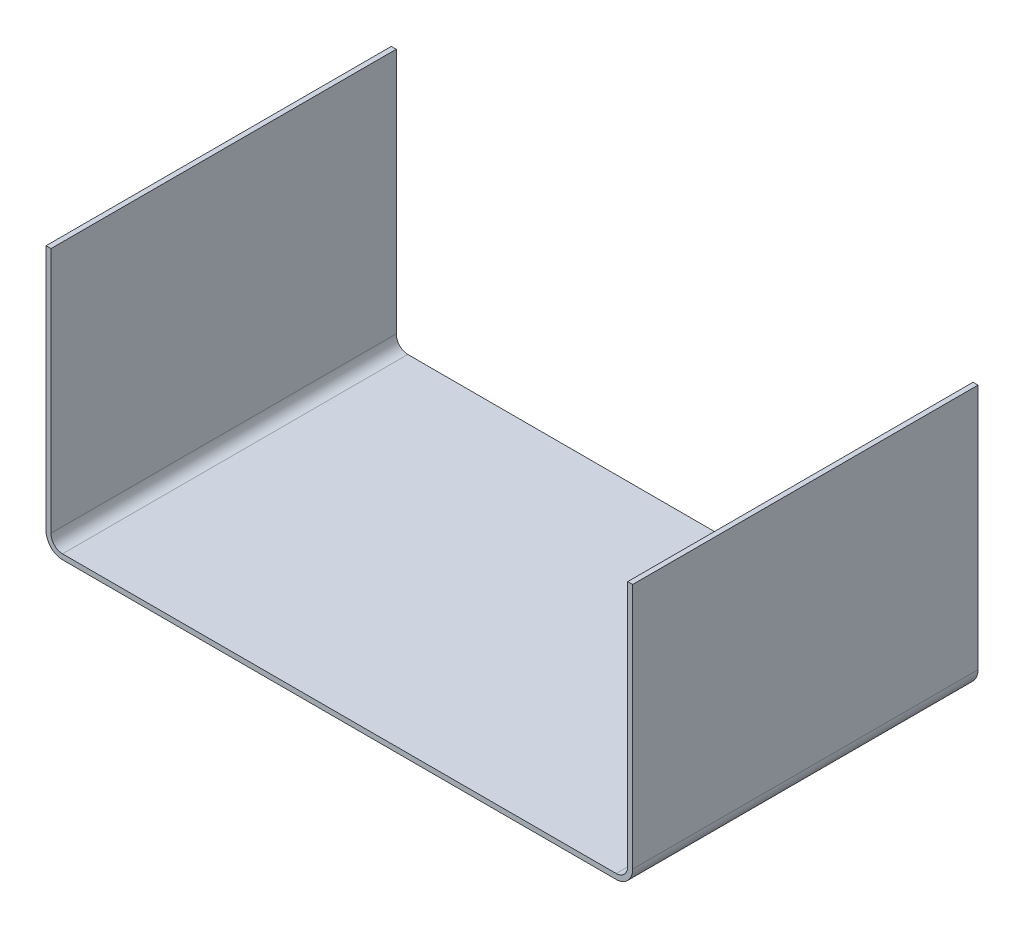
ISO-10303-21;
HEADER;
FILE_DESCRIPTION(('STEP AP214'),'2;1');
FILE_NAME('part.step','',(''),(''),'','','');
FILE_SCHEMA(('AUTOMOTIVE_DESIGN { 1 0 10303 214 1 1 1 1 }'));
ENDSEC;
DATA;
#1=APPLICATION_CONTEXT('core data for automotive mechanical design processes');
#2=APPLICATION_PROTOCOL_DEFINITION('international standard','automotive_design',2000,#1);
#3=PRODUCT_CONTEXT('',#1,'mechanical');
#4=PRODUCT('Part','Part','',(#3));
#5=PRODUCT_RELATED_PRODUCT_CATEGORY('part','',(#4));
#6=PRODUCT_DEFINITION_FORMATION('','',#4);
#7=PRODUCT_DEFINITION_CONTEXT('part definition',#1,'design');
#8=PRODUCT_DEFINITION('design','',#6,#7);
#9=PRODUCT_DEFINITION_SHAPE('','',#8);
#10=(LENGTH_UNIT() NAMED_UNIT(*) SI_UNIT(.MILLI.,.METRE.));
#11=(NAMED_UNIT(*) PLANE_ANGLE_UNIT() SI_UNIT($,.RADIAN.));
#12=(NAMED_UNIT(*) SI_UNIT($,.STERADIAN.) SOLID_ANGLE_UNIT());
#13=UNCERTAINTY_MEASURE_WITH_UNIT(LENGTH_MEASURE(1.E-05),#10,'distance_accuracy_value','');
#14=(GEOMETRIC_REPRESENTATION_CONTEXT(3) GLOBAL_UNCERTAINTY_ASSIGNED_CONTEXT((#13)) GLOBAL_UNIT_ASSIGNED_CONTEXT((#10,
#11,#12)) REPRESENTATION_CONTEXT('',''));
#15=CARTESIAN_POINT('',(0.,0.,0.));
#16=DIRECTION('',(0.,0.,1.));
#17=DIRECTION('',(1.,0.,0.));
#18=AXIS2_PLACEMENT_3D('',#15,#16,#17);
#19=CARTESIAN_POINT('',(6641.30979697069,-104.229808025032,2764.26921068201));
#20=DIRECTION('',(0.,1.,0.));
#21=DIRECTION('',(0.,0.,1.));
#22=AXIS2_PLACEMENT_3D('',#19,#20,#21);
#23=PLANE('',#22);
#24=DIRECTION('',(0.,0.,-1.));
#25=VECTOR('',#24,1.);
#26=CARTESIAN_POINT('',(6412.92867301033,-104.229808025032,3383.60023560305));
#27=LINE('',#26,#25);
#28=CARTESIAN_POINT('',(6412.92867301033,-104.229808025032,3433.60023560305));
#29=VERTEX_POINT('',#28);
#30=CARTESIAN_POINT('',(6412.92867301033,-104.229808025032,3333.60023560305));
#31=VERTEX_POINT('',#30);
#32=EDGE_CURVE('E119',#29,#31,#27,.T.);
#33=ORIENTED_EDGE('',*,*,#32,.F.);
#34=DIRECTION('',(1.,0.,0.));
#35=VECTOR('',#34,1.);
#36=CARTESIAN_POINT('',(6641.30979697069,-104.229808025032,3433.60023560305));
#37=LINE('',#36,#35);
#38=CARTESIAN_POINT('',(6414.36168894564,-104.229808025032,3433.60023560305));
#39=VERTEX_POINT('',#38);
#40=EDGE_CURVE('E125',#29,#39,#37,.T.);
#41=ORIENTED_EDGE('',*,*,#40,.T.);
#42=DIRECTION('',(0.,0.,1.));
#43=VECTOR('',#42,1.);
#44=CARTESIAN_POINT('',(6414.36168894564,-104.229808025032,3383.60023560305));
#45=LINE('',#44,#43);
#46=CARTESIAN_POINT('',(6414.36168894564,-104.229808025032,3333.60023560305));
#47=VERTEX_POINT('',#46);
#48=EDGE_CURVE('E122',#47,#39,#45,.T.);
#49=ORIENTED_EDGE('',*,*,#48,.F.);
#50=DIRECTION('',(1.,0.,0.));
#51=VECTOR('',#50,1.);
#52=CARTESIAN_POINT('',(6641.30979697069,-104.229808025032,3333.60023560305));
#53=LINE('',#52,#51);
#54=EDGE_CURVE('E117',#47,#31,#53,.F.);
#55=ORIENTED_EDGE('',*,*,#54,.T.);
#56=EDGE_LOOP('',(#33,#41,#49,#55));
#57=FACE_BOUND('',#56,.T.);
#58=ADVANCED_FACE('F17',(#57),#23,.T.);
#59=CARTESIAN_POINT('',(6641.30979697069,-104.229808025032,2764.26921068201));
#60=DIRECTION('',(0.,1.,0.));
#61=DIRECTION('',(0.,0.,1.));
#62=AXIS2_PLACEMENT_3D('',#59,#60,#61);
#63=PLANE('',#62);
#64=DIRECTION('',(1.,0.,0.));
#65=VECTOR('',#64,1.);
#66=CARTESIAN_POINT('',(6641.30979697069,-104.229808025032,3433.60023560305));
#67=LINE('',#66,#65);
#68=CARTESIAN_POINT('',(6244.46406030831,-104.229808025032,3433.60023560305));
#69=VERTEX_POINT('',#68);
#70=CARTESIAN_POINT('',(6245.89707624363,-104.229808025032,3433.60023560305));
#71=VERTEX_POINT('',#70);
#72=EDGE_CURVE('E182',#69,#71,#67,.T.);
#73=ORIENTED_EDGE('',*,*,#72,.T.);
#74=DIRECTION('',(0.,0.,1.));
#75=VECTOR('',#74,1.);
#76=CARTESIAN_POINT('',(6245.89707624363,-104.229808025032,3383.60023560305));
#77=LINE('',#76,#75);
#78=CARTESIAN_POINT('',(6245.89707624363,-104.229808025032,3333.60023560305));
#79=VERTEX_POINT('',#78);
#80=EDGE_CURVE('E169',#79,#71,#77,.T.);
#81=ORIENTED_EDGE('',*,*,#80,.F.);
#82=DIRECTION('',(1.,0.,0.));
#83=VECTOR('',#82,1.);
#84=CARTESIAN_POINT('',(6641.30979697069,-104.229808025032,3333.60023560305));
#85=LINE('',#84,#83);
#86=CARTESIAN_POINT('',(6244.46406030831,-104.229808025032,3333.60023560305));
#87=VERTEX_POINT('',#86);
#88=EDGE_CURVE('E104',#79,#87,#85,.F.);
#89=ORIENTED_EDGE('',*,*,#88,.T.);
#90=DIRECTION('',(0.,0.,-1.));
#91=VECTOR('',#90,1.);
#92=CARTESIAN_POINT('',(6244.46406030831,-104.229808025032,3383.60023560305));
#93=LINE('',#92,#91);
#94=EDGE_CURVE('E162',#69,#87,#93,.T.);
#95=ORIENTED_EDGE('',*,*,#94,.F.);
#96=EDGE_LOOP('',(#73,#81,#89,#95));
#97=FACE_BOUND('',#96,.T.);
#98=ADVANCED_FACE('F258',(#97),#63,.T.);
#99=CARTESIAN_POINT('',(6414.36168894564,-175.607151182441,3333.60023560305));
#100=DIRECTION('',(1.,0.,0.));
#101=DIRECTION('',(0.,1.,0.));
#102=AXIS2_PLACEMENT_3D('',#99,#100,#101);
#103=PLANE('',#102);
#104=DIRECTION('',(0.,0.,1.));
#105=VECTOR('',#104,1.);
#106=CARTESIAN_POINT('',(6414.36168894564,-175.607151182441,3383.60023560305));
#107=LINE('',#106,#105);
#108=CARTESIAN_POINT('',(6414.36168894564,-175.607151182441,3333.60023560305));
#109=VERTEX_POINT('',#108);
#110=CARTESIAN_POINT('',(6414.36168894564,-175.607151182441,3433.60023560305));
#111=VERTEX_POINT('',#110);
#112=EDGE_CURVE('E143',#109,#111,#107,.T.);
#113=ORIENTED_EDGE('',*,*,#112,.F.);
#114=DIRECTION('',(0.,1.,0.));
#115=VECTOR('',#114,1.);
#116=CARTESIAN_POINT('',(6414.36168894564,-13.5446511824428,3333.60023560305));
#117=LINE('',#116,#115);
#118=EDGE_CURVE('E158',#47,#109,#117,.F.);
#119=ORIENTED_EDGE('',*,*,#118,.F.);
#120=ORIENTED_EDGE('',*,*,#48,.T.);
#121=DIRECTION('',(0.,1.,0.));
#122=VECTOR('',#121,1.);
#123=CARTESIAN_POINT('',(6414.36168894564,-13.5446511824428,3433.60023560305));
#124=LINE('',#123,#122);
#125=EDGE_CURVE('E306',#111,#39,#124,.T.);
#126=ORIENTED_EDGE('',*,*,#125,.F.);
#127=EDGE_LOOP('',(#113,#119,#120,#126));
#128=FACE_BOUND('',#127,.T.);
#129=ADVANCED_FACE('F335',(#128),#103,.T.);
#130=CARTESIAN_POINT('',(6412.92867301033,-32.1071511824428,3333.60023560305));
#131=DIRECTION('',(-1.,0.,0.));
#132=DIRECTION('',(0.,-1.,0.));
#133=AXIS2_PLACEMENT_3D('',#130,#131,#132);
#134=PLANE('',#133);
#135=DIRECTION('',(0.,0.,-1.));
#136=VECTOR('',#135,1.);
#137=CARTESIAN_POINT('',(6412.92867301033,-175.607151182441,3383.60023560305));
#138=LINE('',#137,#136);
#139=CARTESIAN_POINT('',(6412.92867301033,-175.607151182441,3433.60023560305));
#140=VERTEX_POINT('',#139);
#141=CARTESIAN_POINT('',(6412.92867301033,-175.607151182441,3333.60023560305));
#142=VERTEX_POINT('',#141);
#143=EDGE_CURVE('E134',#140,#142,#138,.T.);
#144=ORIENTED_EDGE('',*,*,#143,.F.);
#145=DIRECTION('',(0.,1.,0.));
#146=VECTOR('',#145,1.);
#147=CARTESIAN_POINT('',(6412.92867301033,-13.5446511824428,3433.60023560305));
#148=LINE('',#147,#146);
#149=EDGE_CURVE('E133',#29,#140,#148,.F.);
#150=ORIENTED_EDGE('',*,*,#149,.F.);
#151=ORIENTED_EDGE('',*,*,#32,.T.);
#152=DIRECTION('',(0.,1.,0.));
#153=VECTOR('',#152,1.);
#154=CARTESIAN_POINT('',(6412.92867301033,-13.5446511824428,3333.60023560305));
#155=LINE('',#154,#153);
#156=EDGE_CURVE('E130',#142,#31,#155,.T.);
#157=ORIENTED_EDGE('',*,*,#156,.F.);
#158=EDGE_LOOP('',(#144,#150,#151,#157));
#159=FACE_BOUND('',#158,.T.);
#160=ADVANCED_FACE('F129',(#159),#134,.T.);
#161=CARTESIAN_POINT('',(6412.92867301033,-175.607151182441,3333.60023560305));
#162=CARTESIAN_POINT('',(6412.92867301033,-175.607151182441,3433.60023560305));
#163=CARTESIAN_POINT('',(6412.92867301033,-179.107151182445,3333.60023560305));
#164=CARTESIAN_POINT('',(6412.92867301033,-179.107151182445,3433.60023560305));
#165=CARTESIAN_POINT('',(6409.58496916126,-179.107151182443,3333.60023560305));
#166=CARTESIAN_POINT('',(6409.58496916126,-179.107151182443,3433.60023560305));
#167=(BOUNDED_SURFACE() B_SPLINE_SURFACE(2,1,((#161,#162),(#163,#164),(#165,#166)),
.UNSPECIFIED.,.F.,.F.,.F.) B_SPLINE_SURFACE_WITH_KNOTS((3,3),(2,2),(622.071814493869,
629.877862906506),(0.,100.),
.UNSPECIFIED.) GEOMETRIC_REPRESENTATION_ITEM() RATIONAL_B_SPLINE_SURFACE(((1.,1.),
(0.707106781185812,0.707106781185812),(1.,1.))) REPRESENTATION_ITEM('') SURFACE());
#168=CARTESIAN_POINT('',(6412.92867301033,-175.607151182441,3433.60023560305));
#169=CARTESIAN_POINT('',(6412.92867950006,-175.709112972489,3433.60023560305));
#170=CARTESIAN_POINT('',(6412.92441633258,-175.811071706564,3433.60023560305));
#171=CARTESIAN_POINT('',(6412.90740160706,-176.014282930853,3433.60023560305));
#172=CARTESIAN_POINT('',(6412.89464966842,-176.115535389196,3433.60023560305));
#173=CARTESIAN_POINT('',(6412.86069754241,-176.316688590461,3433.60023560305));
#174=CARTESIAN_POINT('',(6412.83949198848,-176.416588432976,3433.60023560305));
#175=CARTESIAN_POINT('',(6412.78876237079,-176.614221161187,3433.60023560305));
#176=CARTESIAN_POINT('',(6412.7592385567,-176.711954111826,3433.60023560305));
#177=CARTESIAN_POINT('',(6412.65831459831,-177.001034070461,3433.60023560305));
#178=CARTESIAN_POINT('',(6412.57456441836,-177.188247473885,3433.60023560305));
#179=CARTESIAN_POINT('',(6412.37618012535,-177.545308560089,3433.60023560305));
#180=CARTESIAN_POINT('',(6412.26156376522,-177.715166147987,3433.60023560305));
#181=CARTESIAN_POINT('',(6412.00720190987,-178.028452462096,3433.60023560305));
#182=CARTESIAN_POINT('',(6411.86810176988,-178.172403320672,3433.60023560305));
#183=CARTESIAN_POINT('',(6411.56671433627,-178.433617315818,3433.60023560305));
#184=CARTESIAN_POINT('',(6411.40442553331,-178.550878713893,3433.60023560305));
#185=CARTESIAN_POINT('',(6411.06880080024,-178.74983747908,3433.60023560305));
#186=CARTESIAN_POINT('',(6410.89626264887,-178.832870165028,3433.60023560305));
#187=CARTESIAN_POINT('',(6410.62883703745,-178.933706277148,3433.60023560305));
#188=CARTESIAN_POINT('',(6410.5382638881,-178.963365201204,3433.60023560305));
#189=CARTESIAN_POINT('',(6410.35485887182,-179.01455683014,3433.60023560305));
#190=CARTESIAN_POINT('',(6410.26202786765,-179.03609258866,3433.60023560305));
#191=CARTESIAN_POINT('',(6410.07220096107,-179.071303796307,3433.60023560305));
#192=CARTESIAN_POINT('',(6409.97516120096,-179.084742448878,3433.60023560305));
#193=CARTESIAN_POINT('',(6409.78040512071,-179.102667413654,3433.60023560305));
#194=CARTESIAN_POINT('',(6409.68269002587,-179.107167051604,3433.60023560305));
#195=CARTESIAN_POINT('',(6409.58496916126,-179.107151182443,3433.60023560305));
#196=B_SPLINE_CURVE_WITH_KNOTS('',3,(#168,#169,#170,#171,#172,#173,#174,#175,#176,#177,#178,
#179,#180,#181,#182,#183,#184,#185,#186,#187,#188,#189,#190,#191,#192,#193,#194,#195),
.UNSPECIFIED.,.F.,.F.,(4,2,2,2,2,2,2,2,2,2,2,2,2,4),(0.,0.305790359490351,0.611594429710326,
0.917592941693176,1.22358227032149,1.83560511798299,2.44727670463569,3.04474408804305,
3.64225037810364,4.21352507287377,4.49913160700539,4.78463066939112,5.07811815853222,
5.37116780490491),.UNSPECIFIED.);
#197=CARTESIAN_POINT('',(6409.58496916126,-179.107151182443,3433.60023560305));
#198=VERTEX_POINT('',#197);
#199=EDGE_CURVE('E235',#140,#198,#196,.T.);
#200=CARTESIAN_POINT('',(6409.58496916126,-179.107151182443,3333.60023560305));
#201=CARTESIAN_POINT('',(6409.67588246379,-179.107162769113,3333.60023560305));
#202=CARTESIAN_POINT('',(6409.76679020277,-179.103270218013,3333.60023560305));
#203=CARTESIAN_POINT('',(6409.94793287854,-179.087765988843,3333.60023560305));
#204=CARTESIAN_POINT('',(6410.03816790628,-179.076155374074,3333.60023560305));
#205=CARTESIAN_POINT('',(6410.21715218632,-179.045334548212,3333.60023560305));
#206=CARTESIAN_POINT('',(6410.30590401826,-179.026139372748,3333.60023560305));
#207=CARTESIAN_POINT('',(6410.48145016934,-178.980341233864,3333.60023560305));
#208=CARTESIAN_POINT('',(6410.56824447822,-178.953738231696,3333.60023560305));
#209=CARTESIAN_POINT('',(6410.82478835512,-178.863128280992,3333.60023560305));
#210=CARTESIAN_POINT('',(6410.99085308722,-178.78829353417,3333.60023560305));
#211=CARTESIAN_POINT('',(6411.30831924723,-178.612370144381,3333.60023560305));
#212=CARTESIAN_POINT('',(6411.45971804055,-178.511276796283,3333.60023560305));
#213=CARTESIAN_POINT('',(6411.74708920817,-178.283760744864,3333.60023560305));
#214=CARTESIAN_POINT('',(6411.88269315639,-178.15687254778,3333.60023560305));
#215=CARTESIAN_POINT('',(6412.13173167424,-177.882947883222,3333.60023560305));
#216=CARTESIAN_POINT('',(6412.24516073582,-177.735906425248,3333.60023560305));
#217=CARTESIAN_POINT('',(6412.45173301159,-177.419248394912,3333.60023560305));
#218=CARTESIAN_POINT('',(6412.54381454719,-177.248939781502,3333.60023560305));
#219=CARTESIAN_POINT('',(6412.69936356914,-176.895717023783,3333.60023560305));
#220=CARTESIAN_POINT('',(6412.76282998478,-176.712802408087,3333.60023560305));
#221=CARTESIAN_POINT('',(6412.85035412259,-176.376113473886,3333.60023560305));
#222=CARTESIAN_POINT('',(6412.87970961275,-176.223689285679,3333.60023560305));
#223=CARTESIAN_POINT('',(6412.91887038961,-175.916570559141,3333.60023560305));
#224=CARTESIAN_POINT('',(6412.92870356009,-175.7618795773,3333.60023560305));
#225=CARTESIAN_POINT('',(6412.92867301033,-175.607151182441,3333.60023560305));
#226=B_SPLINE_CURVE_WITH_KNOTS('',3,(#200,#201,#202,#203,#204,#205,#206,#207,#208,#209,#210,
#211,#212,#213,#214,#215,#216,#217,#218,#219,#220,#221,#222,#223,#224,#225),.UNSPECIFIED.,.F.,
.F.,(4,2,2,2,2,2,2,2,2,2,2,2,4),(0.,0.272646928710464,0.545256303206492,0.817327946767584,
1.08940101350723,1.63308345437744,2.17686338193007,2.73150215174068,3.28627851429833,
3.8645336078661,4.4428103363226,4.90727392235046,5.37107363502966),.UNSPECIFIED.);
#227=CARTESIAN_POINT('',(6409.58496916126,-179.107151182443,3333.60023560305));
#228=VERTEX_POINT('',#227);
#229=EDGE_CURVE('E139',#228,#142,#226,.T.);
#230=DIRECTION('',(0.,0.,-1.));
#231=VECTOR('',#230,1.);
#232=CARTESIAN_POINT('',(6409.58496916126,-179.107151182443,3383.60023560305));
#233=LINE('',#232,#231);
#234=EDGE_CURVE('E176',#198,#228,#233,.T.);
#235=ORIENTED_EDGE('',*,*,#199,.F.);
#236=ORIENTED_EDGE('',*,*,#143,.T.);
#237=ORIENTED_EDGE('',*,*,#229,.F.);
#238=ORIENTED_EDGE('',*,*,#234,.F.);
#239=EDGE_LOOP('',(#235,#236,#237,#238));
#240=FACE_BOUND('',#239,.T.);
#241=ADVANCED_FACE('F246',(#240),#167,.T.);
#242=CARTESIAN_POINT('',(6409.58496916126,-179.107151182443,3333.60023560305));
#243=DIRECTION('',(0.,1.,0.));
#244=DIRECTION('',(-1.,0.,0.));
#245=AXIS2_PLACEMENT_3D('',#242,#243,#244);
#246=PLANE('',#245);
#247=DIRECTION('',(1.,0.,0.));
#248=VECTOR('',#247,1.);
#249=CARTESIAN_POINT('',(6435.59889252531,-179.107151182443,3433.60023560305));
#250=LINE('',#249,#248);
#251=CARTESIAN_POINT('',(6249.2407800927,-179.107151182444,3433.60023560305));
#252=VERTEX_POINT('',#251);
#253=EDGE_CURVE('E241',#198,#252,#250,.F.);
#254=ORIENTED_EDGE('',*,*,#253,.F.);
#255=ORIENTED_EDGE('',*,*,#234,.T.);
#256=DIRECTION('',(-1.,0.,0.));
#257=VECTOR('',#256,1.);
#258=CARTESIAN_POINT('',(6435.59889252531,-179.107151182444,3333.60023560305));
#259=LINE('',#258,#257);
#260=CARTESIAN_POINT('',(6249.2407800927,-179.107151182444,3333.60023560305));
#261=VERTEX_POINT('',#260);
#262=EDGE_CURVE('E145',#261,#228,#259,.F.);
#263=ORIENTED_EDGE('',*,*,#262,.F.);
#264=DIRECTION('',(0.,0.,-1.));
#265=VECTOR('',#264,1.);
#266=CARTESIAN_POINT('',(6249.2407800927,-179.107151182444,3383.60023560305));
#267=LINE('',#266,#265);
#268=EDGE_CURVE('E172',#252,#261,#267,.T.);
#269=ORIENTED_EDGE('',*,*,#268,.F.);
#270=EDGE_LOOP('',(#254,#255,#263,#269));
#271=FACE_BOUND('',#270,.T.);
#272=ADVANCED_FACE('F252',(#271),#246,.T.);
#273=CARTESIAN_POINT('',(6249.2407800927,-179.107151182444,3333.60023560305));
#274=CARTESIAN_POINT('',(6249.2407800927,-179.107151182444,3433.60023560305));
#275=CARTESIAN_POINT('',(6245.89707624363,-179.107151182443,3333.60023560305));
#276=CARTESIAN_POINT('',(6245.89707624363,-179.107151182443,3433.60023560305));
#277=CARTESIAN_POINT('',(6245.89707624363,-175.607151182442,3333.60023560305));
#278=CARTESIAN_POINT('',(6245.89707624363,-175.607151182442,3433.60023560305));
#279=(BOUNDED_SURFACE() B_SPLINE_SURFACE(2,1,((#273,#274),(#275,#276),(#277,#278)),
.UNSPECIFIED.,.F.,.F.,.F.) B_SPLINE_SURFACE_WITH_KNOTS((3,3),(2,2),(-151.870909739568,
-144.064861326932),(0.,100.),
.UNSPECIFIED.) GEOMETRIC_REPRESENTATION_ITEM() RATIONAL_B_SPLINE_SURFACE(((1.,1.),
(0.707106781186548,0.707106781186548),(1.,1.))) REPRESENTATION_ITEM('') SURFACE());
#280=CARTESIAN_POINT('',(6249.2407800927,-179.107151182444,3433.60023560305));
#281=CARTESIAN_POINT('',(6249.14986679017,-179.107162769114,3433.60023560305));
#282=CARTESIAN_POINT('',(6249.05895905119,-179.103270218014,3433.60023560305));
#283=CARTESIAN_POINT('',(6248.87781637542,-179.087765988844,3433.60023560305));
#284=CARTESIAN_POINT('',(6248.78758134768,-179.076155374075,3433.60023560305));
#285=CARTESIAN_POINT('',(6248.60859706764,-179.045334548212,3433.60023560305));
#286=CARTESIAN_POINT('',(6248.51984523569,-179.026139372748,3433.60023560305));
#287=CARTESIAN_POINT('',(6248.34429908462,-178.980341233864,3433.60023560305));
#288=CARTESIAN_POINT('',(6248.25750477574,-178.953738231696,3433.60023560305));
#289=CARTESIAN_POINT('',(6248.00096089883,-178.863128280992,3433.60023560305));
#290=CARTESIAN_POINT('',(6247.83489616674,-178.78829353417,3433.60023560305));
#291=CARTESIAN_POINT('',(6247.51743000673,-178.61237014438,3433.60023560305));
#292=CARTESIAN_POINT('',(6247.3660312134,-178.511276796282,3433.60023560305));
#293=CARTESIAN_POINT('',(6247.07866004578,-178.283760744862,3433.60023560305));
#294=CARTESIAN_POINT('',(6246.94305609756,-178.156872547777,3433.60023560305));
#295=CARTESIAN_POINT('',(6246.69401757972,-177.882947883217,3433.60023560305));
#296=CARTESIAN_POINT('',(6246.58058851813,-177.735906425243,3433.60023560305));
#297=CARTESIAN_POINT('',(6246.37401624237,-177.419248394906,3433.60023560305));
#298=CARTESIAN_POINT('',(6246.28193470677,-177.248939781495,3433.60023560305));
#299=CARTESIAN_POINT('',(6246.12638568482,-176.895717023776,3433.60023560305));
#300=CARTESIAN_POINT('',(6246.06291926917,-176.712802408081,3433.60023560305));
#301=CARTESIAN_POINT('',(6245.97539513137,-176.376113473883,3433.60023560305));
#302=CARTESIAN_POINT('',(6245.94603964121,-176.223689285676,3433.60023560305));
#303=CARTESIAN_POINT('',(6245.90687886436,-175.91657055914,3433.60023560305));
#304=CARTESIAN_POINT('',(6245.89704569387,-175.7618795773,3433.60023560305));
#305=CARTESIAN_POINT('',(6245.89707624363,-175.607151182442,3433.60023560305));
#306=B_SPLINE_CURVE_WITH_KNOTS('',3,(#280,#281,#282,#283,#284,#285,#286,#287,#288,#289,#290,
#291,#292,#293,#294,#295,#296,#297,#298,#299,#300,#301,#302,#303,#304,#305),.UNSPECIFIED.,.F.,
.F.,(4,2,2,2,2,2,2,2,2,2,2,2,4),(0.,0.272646928711358,0.545256303207454,0.817327946769496,
1.08940101350912,1.63308345438128,2.17686338193497,2.7315021517477,3.28627851430741,
3.86453360787427,4.44281033632844,4.90727392235334,5.37107363502952),.UNSPECIFIED.);
#307=CARTESIAN_POINT('',(6245.89707624363,-175.607151182442,3433.60023560305));
#308=VERTEX_POINT('',#307);
#309=EDGE_CURVE('E230',#252,#308,#306,.T.);
#310=CARTESIAN_POINT('',(6245.89707624363,-175.607151182442,3333.60023560305));
#311=CARTESIAN_POINT('',(6245.89706974392,-175.709151537206,3333.60023560305));
#312=CARTESIAN_POINT('',(6245.90133614202,-175.811148832904,3333.60023560305));
#313=CARTESIAN_POINT('',(6245.91836373283,-176.014436384427,3333.60023560305));
#314=CARTESIAN_POINT('',(6245.93112530718,-176.115726608281,3333.60023560305));
#315=CARTESIAN_POINT('',(6245.9651030786,-176.316953986902,3333.60023560305));
#316=CARTESIAN_POINT('',(6245.98632466564,-176.416890236985,3333.60023560305));
#317=CARTESIAN_POINT('',(6246.03709252447,-176.614593305289,3333.60023560305));
#318=CARTESIAN_POINT('',(6246.06663854585,-176.712360188675,3333.60023560305));
#319=CARTESIAN_POINT('',(6246.16763824753,-177.001537418147,3333.60023560305));
#320=CARTESIAN_POINT('',(6246.25145104716,-177.188809413833,3333.60023560305));
#321=CARTESIAN_POINT('',(6246.4499814172,-177.545967484595,3333.60023560305));
#322=CARTESIAN_POINT('',(6246.56468113853,-177.715863522979,3333.60023560305));
#323=CARTESIAN_POINT('',(6246.81917317023,-178.029138089733,3333.60023560305));
#324=CARTESIAN_POINT('',(6246.95830898776,-178.173048063454,3333.60023560305));
#325=CARTESIAN_POINT('',(6247.25976036081,-178.434174285758,3333.60023560305));
#326=CARTESIAN_POINT('',(6247.42207742222,-178.551388798873,3333.60023560305));
#327=CARTESIAN_POINT('',(6247.75774682479,-178.75025005927,3333.60023560305));
#328=CARTESIAN_POINT('',(6247.93030155516,-178.833232677223,3333.60023560305));
#329=CARTESIAN_POINT('',(6248.19774501259,-178.933992398203,3333.60023560305));
#330=CARTESIAN_POINT('',(6248.28832286394,-178.96362563083,3333.60023560305));
#331=CARTESIAN_POINT('',(6248.47173494674,-179.014765697926,3333.60023560305));
#332=CARTESIAN_POINT('',(6248.564568315,-179.036275590657,3333.60023560305));
#333=CARTESIAN_POINT('',(6248.75425982656,-179.071408957632,3333.60023560305));
#334=CARTESIAN_POINT('',(6248.85115942524,-179.084808246507,3333.60023560305));
#335=CARTESIAN_POINT('',(6249.04563159107,-179.102680586067,3333.60023560305));
#336=CARTESIAN_POINT('',(6249.14320293666,-179.107166941417,3333.60023560305));
#337=CARTESIAN_POINT('',(6249.2407800927,-179.107151182444,3333.60023560305));
#338=B_SPLINE_CURVE_WITH_KNOTS('',3,(#310,#311,#312,#313,#314,#315,#316,#317,#318,#319,#320,
#321,#322,#323,#324,#325,#326,#327,#328,#329,#330,#331,#332,#333,#334,#335,#336,#337),
.UNSPECIFIED.,.F.,.F.,(4,2,2,2,2,2,2,2,2,2,2,2,2,4),(0.,0.305905946506582,0.611825636379122,
0.917940543620825,1.22404624318122,1.83630248885241,2.44820567736733,3.04565943468585,
3.64315202130016,4.21440658116368,4.50000259037968,4.78549097142824,5.07854763968283,
5.37116652175204),.UNSPECIFIED.);
#339=CARTESIAN_POINT('',(6245.89707624363,-175.607151182442,3333.60023560305));
#340=VERTEX_POINT('',#339);
#341=EDGE_CURVE('E21',#340,#261,#338,.T.);
#342=DIRECTION('',(0.,0.,-1.));
#343=VECTOR('',#342,1.);
#344=CARTESIAN_POINT('',(6245.89707624363,-175.607151182442,3383.60023560305));
#345=LINE('',#344,#343);
#346=EDGE_CURVE('E94',#308,#340,#345,.T.);
#347=ORIENTED_EDGE('',*,*,#309,.F.);
#348=ORIENTED_EDGE('',*,*,#268,.T.);
#349=ORIENTED_EDGE('',*,*,#341,.F.);
#350=ORIENTED_EDGE('',*,*,#346,.F.);
#351=EDGE_LOOP('',(#347,#348,#349,#350));
#352=FACE_BOUND('',#351,.T.);
#353=ADVANCED_FACE('F254',(#352),#279,.T.);
#354=CARTESIAN_POINT('',(6245.89707624363,-175.607151182442,3333.60023560305));
#355=DIRECTION('',(1.,0.,0.));
#356=DIRECTION('',(0.,1.,0.));
#357=AXIS2_PLACEMENT_3D('',#354,#355,#356);
#358=PLANE('',#357);
#359=ORIENTED_EDGE('',*,*,#346,.T.);
#360=DIRECTION('',(0.,1.,0.));
#361=VECTOR('',#360,1.);
#362=CARTESIAN_POINT('',(6245.89707624363,-13.5446511824428,3333.60023560305));
#363=LINE('',#362,#361);
#364=EDGE_CURVE('E152',#79,#340,#363,.F.);
#365=ORIENTED_EDGE('',*,*,#364,.F.);
#366=ORIENTED_EDGE('',*,*,#80,.T.);
#367=DIRECTION('',(0.,1.,0.));
#368=VECTOR('',#367,1.);
#369=CARTESIAN_POINT('',(6245.89707624363,-13.5446511824428,3433.60023560305));
#370=LINE('',#369,#368);
#371=EDGE_CURVE('E316',#308,#71,#370,.T.);
#372=ORIENTED_EDGE('',*,*,#371,.F.);
#373=EDGE_LOOP('',(#359,#365,#366,#372));
#374=FACE_BOUND('',#373,.T.);
#375=ADVANCED_FACE('F284',(#374),#358,.T.);
#376=CARTESIAN_POINT('',(6244.46406030831,-32.1071511824428,3333.60023560305));
#377=DIRECTION('',(-1.,0.,0.));
#378=DIRECTION('',(0.,-1.,0.));
#379=AXIS2_PLACEMENT_3D('',#376,#377,#378);
#380=PLANE('',#379);
#381=DIRECTION('',(0.,0.,-1.));
#382=VECTOR('',#381,1.);
#383=CARTESIAN_POINT('',(6244.46406030831,-175.607151182442,3383.60023560305));
#384=LINE('',#383,#382);
#385=CARTESIAN_POINT('',(6244.46406030831,-175.607151182442,3433.60023560305));
#386=VERTEX_POINT('',#385);
#387=CARTESIAN_POINT('',(6244.46406030831,-175.607151182442,3333.60023560305));
#388=VERTEX_POINT('',#387);
#389=EDGE_CURVE('E165',#386,#388,#384,.T.);
#390=ORIENTED_EDGE('',*,*,#389,.F.);
#391=DIRECTION('',(0.,1.,0.));
#392=VECTOR('',#391,1.);
#393=CARTESIAN_POINT('',(6244.46406030831,-13.5446511824428,3433.60023560305));
#394=LINE('',#393,#392);
#395=EDGE_CURVE('E186',#69,#386,#394,.F.);
#396=ORIENTED_EDGE('',*,*,#395,.F.);
#397=ORIENTED_EDGE('',*,*,#94,.T.);
#398=DIRECTION('',(0.,1.,0.));
#399=VECTOR('',#398,1.);
#400=CARTESIAN_POINT('',(6244.46406030831,-13.5446511824428,3333.60023560305));
#401=LINE('',#400,#399);
#402=EDGE_CURVE('E154',#388,#87,#401,.T.);
#403=ORIENTED_EDGE('',*,*,#402,.F.);
#404=EDGE_LOOP('',(#390,#396,#397,#403));
#405=FACE_BOUND('',#404,.T.);
#406=ADVANCED_FACE('F274',(#405),#380,.T.);
#407=CARTESIAN_POINT('',(6435.59889252531,-13.5446511824428,3333.60023560305));
#408=DIRECTION('',(0.,0.,-1.));
#409=DIRECTION('',(-1.,0.,0.));
#410=AXIS2_PLACEMENT_3D('',#407,#408,#409);
#411=PLANE('',#410);
#412=ORIENTED_EDGE('',*,*,#156,.T.);
#413=ORIENTED_EDGE('',*,*,#54,.F.);
#414=ORIENTED_EDGE('',*,*,#118,.T.);
#415=CARTESIAN_POINT('',(6409.58496916126,-180.607151182443,3333.60023560305));
#416=CARTESIAN_POINT('',(6409.71484284474,-180.607169259997,3333.60023560305));
#417=CARTESIAN_POINT('',(6409.84471227486,-180.601607710075,3333.60023560305));
#418=CARTESIAN_POINT('',(6410.10348998862,-180.579457286302,3333.60023560305));
#419=CARTESIAN_POINT('',(6410.23239840217,-180.562869931454,3333.60023560305));
#420=CARTESIAN_POINT('',(6410.48808531103,-180.518843226709,3333.60023560305));
#421=CARTESIAN_POINT('',(6410.61486750611,-180.491425347269,3333.60023560305));
#422=CARTESIAN_POINT('',(6410.86566490943,-180.42598879148,3333.60023560305));
#423=CARTESIAN_POINT('',(6410.9896801032,-180.387970059679,3333.60023560305));
#424=CARTESIAN_POINT('',(6411.23406200385,-180.301672636485,3333.60023560305));
#425=CARTESIAN_POINT('',(6411.35442932363,-180.253395679659,3333.60023560305));
#426=CARTESIAN_POINT('',(6411.59077013,-180.14697396264,3333.60023560305));
#427=CARTESIAN_POINT('',(6411.70674197958,-180.088825569326,3333.60023560305));
#428=CARTESIAN_POINT('',(6411.93346452099,-179.963172459688,3333.60023560305));
#429=CARTESIAN_POINT('',(6412.04421637984,-179.895669848088,3333.60023560305));
#430=CARTESIAN_POINT('',(6412.25987204128,-179.751819494291,3333.60023560305));
#431=CARTESIAN_POINT('',(6412.36477362766,-179.67546843337,3333.60023560305));
#432=CARTESIAN_POINT('',(6412.57005277893,-179.512949682128,3333.60023560305));
#433=CARTESIAN_POINT('',(6412.67030148393,-179.426619003786,3333.60023560305));
#434=CARTESIAN_POINT('',(6412.86344124698,-179.246066353772,3333.60023560305));
#435=CARTESIAN_POINT('',(6412.95632958882,-179.151841495049,3333.60023560305));
#436=CARTESIAN_POINT('',(6413.22308781294,-178.858389729211,3333.60023560305));
#437=CARTESIAN_POINT('',(6413.38521184567,-178.648257515456,3333.60023560305));
#438=CARTESIAN_POINT('',(6413.68037839552,-178.195832911015,3333.60023560305));
#439=CARTESIAN_POINT('',(6413.81189977567,-177.952555829312,3333.60023560305));
#440=CARTESIAN_POINT('',(6414.03409539481,-177.447967164988,3333.60023560305));
#441=CARTESIAN_POINT('',(6414.12476810535,-177.186654907963,3333.60023560305));
#442=CARTESIAN_POINT('',(6414.24980661331,-176.705667155675,3333.60023560305));
#443=CARTESIAN_POINT('',(6414.29174213068,-176.487919108932,3333.60023560305));
#444=CARTESIAN_POINT('',(6414.34768430716,-176.049179654727,3333.60023560305));
#445=CARTESIAN_POINT('',(6414.36173080026,-175.828193327967,3333.60023560305));
#446=CARTESIAN_POINT('',(6414.36168894564,-175.607151182441,3333.60023560305));
#447=B_SPLINE_CURVE_WITH_KNOTS('',3,(#415,#416,#417,#418,#419,#420,#421,#422,#423,#424,#425,
#426,#427,#428,#429,#430,#431,#432,#433,#434,#435,#436,#437,#438,#439,#440,#441,#442,#443,#444,
#445,#446),.UNSPECIFIED.,.F.,.F.,(4,2,2,2,2,2,2,2,2,2,2,2,2,2,2,4),(0.,0.389495612444545,
0.778937576011393,1.16761135253035,1.55628716215686,1.94489730265719,2.33365077999339,
2.72231692832129,3.11112932545737,3.50755749519726,3.90413128449337,4.69666894528995,
5.52274765038234,6.34885726245785,7.01237667106742,7.6749476891793),.UNSPECIFIED.);
#448=CARTESIAN_POINT('',(6409.58496916126,-180.607151182443,3333.60023560305));
#449=VERTEX_POINT('',#448);
#450=EDGE_CURVE('E140',#449,#109,#447,.T.);
#451=ORIENTED_EDGE('',*,*,#450,.F.);
#452=DIRECTION('',(1.,0.,0.));
#453=VECTOR('',#452,1.);
#454=CARTESIAN_POINT('',(6329.78564393358,-180.607151182443,3333.60023560305));
#455=LINE('',#454,#453);
#456=CARTESIAN_POINT('',(6249.2407800927,-180.607151182443,3333.60023560305));
#457=VERTEX_POINT('',#456);
#458=EDGE_CURVE('E148',#457,#449,#455,.T.);
#459=ORIENTED_EDGE('',*,*,#458,.F.);
#460=CARTESIAN_POINT('',(6244.46406030831,-175.607151182442,3333.60023560305));
#461=CARTESIAN_POINT('',(6244.46404933446,-175.752807793788,3333.60023560305));
#462=CARTESIAN_POINT('',(6244.4701404251,-175.898464672507,3333.60023560305));
#463=CARTESIAN_POINT('',(6244.49444887873,-176.188769510352,3333.60023560305));
#464=CARTESIAN_POINT('',(6244.51266678542,-176.333417423948,3333.60023560305));
#465=CARTESIAN_POINT('',(6244.56116641558,-176.620772960076,3333.60023560305));
#466=CARTESIAN_POINT('',(6244.5914558023,-176.763479290418,3333.60023560305));
#467=CARTESIAN_POINT('',(6244.66393861612,-177.045833401679,3333.60023560305));
#468=CARTESIAN_POINT('',(6244.70613168594,-177.185481274259,3333.60023560305));
#469=CARTESIAN_POINT('',(6244.80223939946,-177.460812467452,3333.60023560305));
#470=CARTESIAN_POINT('',(6244.85616343549,-177.596492511925,3333.60023560305));
#471=CARTESIAN_POINT('',(6244.97543994384,-177.862797079675,3333.60023560305));
#472=CARTESIAN_POINT('',(6245.0407966666,-177.993419700564,3333.60023560305));
#473=CARTESIAN_POINT('',(6245.18248726674,-178.248420941287,3333.60023560305));
#474=CARTESIAN_POINT('',(6245.25881133496,-178.372805008167,3333.60023560305));
#475=CARTESIAN_POINT('',(6245.42205009941,-178.614484852949,3333.60023560305));
#476=CARTESIAN_POINT('',(6245.50896830979,-178.731778259425,3333.60023560305));
#477=CARTESIAN_POINT('',(6245.69067402862,-178.955588375696,3333.60023560305));
#478=CARTESIAN_POINT('',(6245.78523027255,-179.062292826595,3333.60023560305));
#479=CARTESIAN_POINT('',(6245.98329241606,-179.267042268014,3333.60023560305));
#480=CARTESIAN_POINT('',(6246.08679787938,-179.365087680178,3333.60023560305));
#481=CARTESIAN_POINT('',(6246.30210344346,-179.55168988602,3333.60023560305));
#482=CARTESIAN_POINT('',(6246.41390643709,-179.640243343843,3333.60023560305));
#483=CARTESIAN_POINT('',(6246.64493611669,-179.806969911586,3333.60023560305));
#484=CARTESIAN_POINT('',(6246.76415960094,-179.885147453416,3333.60023560305));
#485=CARTESIAN_POINT('',(6247.00384561292,-180.027249130495,3333.60023560305));
#486=CARTESIAN_POINT('',(6247.12402828056,-180.091645589044,3333.60023560305));
#487=CARTESIAN_POINT('',(6247.36950424459,-180.209682495027,3333.60023560305));
#488=CARTESIAN_POINT('',(6247.49479526116,-180.263327678803,3333.60023560305));
#489=CARTESIAN_POINT('',(6247.74950547129,-180.359349965849,3333.60023560305));
#490=CARTESIAN_POINT('',(6247.87892110735,-180.401736500155,3333.60023560305));
#491=CARTESIAN_POINT('',(6248.14094702109,-180.474879671642,3333.60023560305));
#492=CARTESIAN_POINT('',(6248.27355607833,-180.50564067907,3333.60023560305));
#493=CARTESIAN_POINT('',(6248.54473187955,-180.555938807736,3333.60023560305));
#494=CARTESIAN_POINT('',(6248.68336150174,-180.575137795059,3333.60023560305));
#495=CARTESIAN_POINT('',(6248.96158725423,-180.60074670796,3333.60023560305));
#496=CARTESIAN_POINT('',(6249.10118163409,-180.607175670321,3333.60023560305));
#497=CARTESIAN_POINT('',(6249.2407800927,-180.607151182443,3333.60023560305));
#498=B_SPLINE_CURVE_WITH_KNOTS('',3,(#460,#461,#462,#463,#464,#465,#466,#467,#468,#469,#470,
#471,#472,#473,#474,#475,#476,#477,#478,#479,#480,#481,#482,#483,#484,#485,#486,#487,#488,#489,
#490,#491,#492,#493,#494,#495,#496,#497),.UNSPECIFIED.,.F.,.F.,(4,2,2,2,2,2,2,2,2,2,2,2,2,2,2,2,
2,2,4),(0.,0.436843370699672,0.873706328155864,1.31084705955923,1.74797467188433,
2.18545356455773,2.62309545016551,3.06034831852045,3.49774662342275,3.92492703461237,
4.35208663312265,4.77939586382872,5.20652198458428,5.61505484195946,6.02340732771421,
6.43141666218957,6.83927246559798,7.25854030723142,7.67718265919788),.UNSPECIFIED.);
#499=EDGE_CURVE('E209',#388,#457,#498,.T.);
#500=ORIENTED_EDGE('',*,*,#499,.F.);
#501=ORIENTED_EDGE('',*,*,#402,.T.);
#502=ORIENTED_EDGE('',*,*,#88,.F.);
#503=ORIENTED_EDGE('',*,*,#364,.T.);
#504=ORIENTED_EDGE('',*,*,#341,.T.);
#505=ORIENTED_EDGE('',*,*,#262,.T.);
#506=ORIENTED_EDGE('',*,*,#229,.T.);
#507=EDGE_LOOP('',(#412,#413,#414,#451,#459,#500,#501,#502,#503,#504,#505,#506));
#508=FACE_BOUND('',#507,.T.);
#509=ADVANCED_FACE('F136',(#508),#411,.T.);
#510=CARTESIAN_POINT('',(6409.58496916126,-180.607151182443,3333.60023560305));
#511=CARTESIAN_POINT('',(6409.58496916126,-180.607151182443,3433.60023560305));
#512=CARTESIAN_POINT('',(6414.36168894565,-180.607151182443,3333.60023560305));
#513=CARTESIAN_POINT('',(6414.36168894565,-180.607151182443,3433.60023560305));
#514=CARTESIAN_POINT('',(6414.36168894564,-175.607151182441,3333.60023560305));
#515=CARTESIAN_POINT('',(6414.36168894564,-175.607151182441,3433.60023560305));
#516=(BOUNDED_SURFACE() B_SPLINE_SURFACE(2,1,((#510,#511),(#512,#513),(#514,#515)),
.UNSPECIFIED.,.F.,.F.,.F.) B_SPLINE_SURFACE_WITH_KNOTS((3,3),(2,2),(323.70347658347,
331.557458217445),(0.,100.),
.UNSPECIFIED.) GEOMETRIC_REPRESENTATION_ITEM() RATIONAL_B_SPLINE_SURFACE(((1.,1.),
(0.707106781186483,0.707106781186483),(1.,1.))) REPRESENTATION_ITEM('') SURFACE());
#517=CARTESIAN_POINT('',(6409.58496916126,-180.607151182443,3433.60023560305));
#518=CARTESIAN_POINT('',(6409.71484284474,-180.607169259997,3433.60023560305));
#519=CARTESIAN_POINT('',(6409.84471227486,-180.601607710075,3433.60023560305));
#520=CARTESIAN_POINT('',(6410.10348998862,-180.579457286302,3433.60023560305));
#521=CARTESIAN_POINT('',(6410.23239840217,-180.562869931454,3433.60023560305));
#522=CARTESIAN_POINT('',(6410.48808531103,-180.51884322671,3433.60023560305));
#523=CARTESIAN_POINT('',(6410.61486750611,-180.491425347269,3433.60023560305));
#524=CARTESIAN_POINT('',(6410.86566490943,-180.42598879148,3433.60023560305));
#525=CARTESIAN_POINT('',(6410.9896801032,-180.387970059679,3433.60023560305));
#526=CARTESIAN_POINT('',(6411.23406200385,-180.301672636485,3433.60023560305));
#527=CARTESIAN_POINT('',(6411.35442932363,-180.253395679659,3433.60023560305));
#528=CARTESIAN_POINT('',(6411.59077013,-180.14697396264,3433.60023560305));
#529=CARTESIAN_POINT('',(6411.70674197958,-180.088825569326,3433.60023560305));
#530=CARTESIAN_POINT('',(6411.93346452099,-179.963172459688,3433.60023560305));
#531=CARTESIAN_POINT('',(6412.04421637984,-179.895669848088,3433.60023560305));
#532=CARTESIAN_POINT('',(6412.25987204128,-179.751819494291,3433.60023560305));
#533=CARTESIAN_POINT('',(6412.36477362766,-179.67546843337,3433.60023560305));
#534=CARTESIAN_POINT('',(6412.57005277893,-179.512949682129,3433.60023560305));
#535=CARTESIAN_POINT('',(6412.67030148393,-179.426619003786,3433.60023560305));
#536=CARTESIAN_POINT('',(6412.86344124698,-179.246066353773,3433.60023560305));
#537=CARTESIAN_POINT('',(6412.95632958882,-179.151841495049,3433.60023560305));
#538=CARTESIAN_POINT('',(6413.22308781294,-178.85838972921,3433.60023560305));
#539=CARTESIAN_POINT('',(6413.38521184567,-178.648257515455,3433.60023560305));
#540=CARTESIAN_POINT('',(6413.68037839552,-178.195832911015,3433.60023560305));
#541=CARTESIAN_POINT('',(6413.81189977567,-177.952555829313,3433.60023560305));
#542=CARTESIAN_POINT('',(6414.03409539481,-177.447967164989,3433.60023560305));
#543=CARTESIAN_POINT('',(6414.12476810535,-177.186654907963,3433.60023560305));
#544=CARTESIAN_POINT('',(6414.24980661331,-176.705667155675,3433.60023560305));
#545=CARTESIAN_POINT('',(6414.29174213068,-176.487919108932,3433.60023560305));
#546=CARTESIAN_POINT('',(6414.34768430716,-176.049179654727,3433.60023560305));
#547=CARTESIAN_POINT('',(6414.36173080026,-175.828193327967,3433.60023560305));
#548=CARTESIAN_POINT('',(6414.36168894564,-175.607151182441,3433.60023560305));
#549=B_SPLINE_CURVE_WITH_KNOTS('',3,(#517,#518,#519,#520,#521,#522,#523,#524,#525,#526,#527,
#528,#529,#530,#531,#532,#533,#534,#535,#536,#537,#538,#539,#540,#541,#542,#543,#544,#545,#546,
#547,#548),.UNSPECIFIED.,.F.,.F.,(4,2,2,2,2,2,2,2,2,2,2,2,2,2,2,4),(0.,0.389495612444546,
0.77893757601137,1.16761135253034,1.55628716215688,1.94489730265715,2.33365077999337,
2.72231692832139,3.11112932545741,3.50755749519771,3.90413128449371,4.69666894529003,
5.52274765038215,6.34885726245795,7.01237667106758,7.67494768917951),.UNSPECIFIED.);
#550=CARTESIAN_POINT('',(6409.58496916126,-180.607151182443,3433.60023560305));
#551=VERTEX_POINT('',#550);
#552=EDGE_CURVE('E242',#551,#111,#549,.T.);
#553=DIRECTION('',(0.,0.,1.));
#554=VECTOR('',#553,1.);
#555=CARTESIAN_POINT('',(6409.58496916126,-180.607151182443,3383.60023560305));
#556=LINE('',#555,#554);
#557=EDGE_CURVE('E296',#449,#551,#556,.T.);
#558=ORIENTED_EDGE('',*,*,#552,.F.);
#559=ORIENTED_EDGE('',*,*,#557,.F.);
#560=ORIENTED_EDGE('',*,*,#450,.T.);
#561=ORIENTED_EDGE('',*,*,#112,.T.);
#562=EDGE_LOOP('',(#558,#559,#560,#561));
#563=FACE_BOUND('',#562,.T.);
#564=ADVANCED_FACE('F222',(#563),#516,.T.);
#565=CARTESIAN_POINT('',(6435.59889252531,-13.5446511824428,3433.60023560305));
#566=DIRECTION('',(0.,0.,1.));
#567=DIRECTION('',(1.,0.,0.));
#568=AXIS2_PLACEMENT_3D('',#565,#566,#567);
#569=PLANE('',#568);
#570=ORIENTED_EDGE('',*,*,#309,.T.);
#571=ORIENTED_EDGE('',*,*,#371,.T.);
#572=ORIENTED_EDGE('',*,*,#72,.F.);
#573=ORIENTED_EDGE('',*,*,#395,.T.);
#574=CARTESIAN_POINT('',(6249.2407800927,-180.607151182443,3433.60023560305));
#575=CARTESIAN_POINT('',(6249.11090640922,-180.607169259997,3433.60023560305));
#576=CARTESIAN_POINT('',(6248.9810369791,-180.601607710075,3433.60023560305));
#577=CARTESIAN_POINT('',(6248.72225926534,-180.579457286302,3433.60023560305));
#578=CARTESIAN_POINT('',(6248.59335085179,-180.562869931454,3433.60023560305));
#579=CARTESIAN_POINT('',(6248.33766394293,-180.518843226709,3433.60023560305));
#580=CARTESIAN_POINT('',(6248.21088174785,-180.491425347269,3433.60023560305));
#581=CARTESIAN_POINT('',(6247.96008434453,-180.425988791479,3433.60023560305));
#582=CARTESIAN_POINT('',(6247.83606915076,-180.387970059679,3433.60023560305));
#583=CARTESIAN_POINT('',(6247.59168725011,-180.301672636485,3433.60023560305));
#584=CARTESIAN_POINT('',(6247.47131993033,-180.253395679659,3433.60023560305));
#585=CARTESIAN_POINT('',(6247.23497912396,-180.14697396264,3433.60023560305));
#586=CARTESIAN_POINT('',(6247.11900727438,-180.088825569327,3433.60023560305));
#587=CARTESIAN_POINT('',(6246.89228473297,-179.963172459688,3433.60023560305));
#588=CARTESIAN_POINT('',(6246.78153287412,-179.895669848088,3433.60023560305));
#589=CARTESIAN_POINT('',(6246.56587721268,-179.751819494289,3433.60023560305));
#590=CARTESIAN_POINT('',(6246.46097562629,-179.675468433369,3433.60023560305));
#591=CARTESIAN_POINT('',(6246.25569647503,-179.512949682128,3433.60023560305));
#592=CARTESIAN_POINT('',(6246.15544777003,-179.426619003785,3433.60023560305));
#593=CARTESIAN_POINT('',(6245.96230800698,-179.246066353772,3433.60023560305));
#594=CARTESIAN_POINT('',(6245.86941966513,-179.151841495048,3433.60023560305));
#595=CARTESIAN_POINT('',(6245.60266144101,-178.858389729209,3433.60023560305));
#596=CARTESIAN_POINT('',(6245.44053740828,-178.648257515455,3433.60023560305));
#597=CARTESIAN_POINT('',(6245.14537085843,-178.195832911014,3433.60023560305));
#598=CARTESIAN_POINT('',(6245.01384947828,-177.95255582931,3433.60023560305));
#599=CARTESIAN_POINT('',(6244.79165385914,-177.447967164983,3433.60023560305));
#600=CARTESIAN_POINT('',(6244.7009811486,-177.186654907956,3433.60023560305));
#601=CARTESIAN_POINT('',(6244.57594264064,-176.705667155668,3433.60023560305));
#602=CARTESIAN_POINT('',(6244.53400712327,-176.487919108927,3433.60023560305));
#603=CARTESIAN_POINT('',(6244.47806494679,-176.049179654725,3433.60023560305));
#604=CARTESIAN_POINT('',(6244.46401845369,-175.828193327966,3433.60023560305));
#605=CARTESIAN_POINT('',(6244.46406030831,-175.607151182442,3433.60023560305));
#606=B_SPLINE_CURVE_WITH_KNOTS('',3,(#574,#575,#576,#577,#578,#579,#580,#581,#582,#583,#584,
#585,#586,#587,#588,#589,#590,#591,#592,#593,#594,#595,#596,#597,#598,#599,#600,#601,#602,#603,
#604,#605),.UNSPECIFIED.,.F.,.F.,(4,2,2,2,2,2,2,2,2,2,2,2,2,2,2,4),(0.,0.389495612445439,
0.778937576012259,1.16761135253123,1.55628716215866,1.94489730265891,2.33365077999572,
2.72231692832437,3.1111293254604,3.50755749520071,3.90413128449798,4.69666894529551,
5.52274765039135,6.34885726247113,7.01237667107676,7.67494768918421),.UNSPECIFIED.);
#607=CARTESIAN_POINT('',(6249.2407800927,-180.607151182443,3433.60023560305));
#608=VERTEX_POINT('',#607);
#609=EDGE_CURVE('E41',#608,#386,#606,.T.);
#610=ORIENTED_EDGE('',*,*,#609,.F.);
#611=DIRECTION('',(-1.,0.,0.));
#612=VECTOR('',#611,1.);
#613=CARTESIAN_POINT('',(6329.78564393358,-180.607151182443,3433.60023560305));
#614=LINE('',#613,#612);
#615=EDGE_CURVE('E32',#551,#608,#614,.T.);
#616=ORIENTED_EDGE('',*,*,#615,.F.);
#617=ORIENTED_EDGE('',*,*,#552,.T.);
#618=ORIENTED_EDGE('',*,*,#125,.T.);
#619=ORIENTED_EDGE('',*,*,#40,.F.);
#620=ORIENTED_EDGE('',*,*,#149,.T.);
#621=ORIENTED_EDGE('',*,*,#199,.T.);
#622=ORIENTED_EDGE('',*,*,#253,.T.);
#623=EDGE_LOOP('',(#570,#571,#572,#573,#610,#616,#617,#618,#619,#620,#621,#622));
#624=FACE_BOUND('',#623,.T.);
#625=ADVANCED_FACE('F218',(#624),#569,.T.);
#626=CARTESIAN_POINT('',(6244.46406030831,-175.607151182442,3333.60023560305));
#627=CARTESIAN_POINT('',(6244.46406030831,-175.607151182442,3433.60023560305));
#628=CARTESIAN_POINT('',(6244.46406030831,-180.607151182443,3333.60023560305));
#629=CARTESIAN_POINT('',(6244.46406030831,-180.607151182443,3433.60023560305));
#630=CARTESIAN_POINT('',(6249.2407800927,-180.607151182443,3333.60023560305));
#631=CARTESIAN_POINT('',(6249.2407800927,-180.607151182443,3433.60023560305));
#632=(BOUNDED_SURFACE() B_SPLINE_SURFACE(2,1,((#626,#627),(#628,#629),(#630,#631)),
.UNSPECIFIED.,.F.,.F.,.F.) B_SPLINE_SURFACE_WITH_KNOTS((3,3),(2,2),(146.449494949494,
154.303476583469),(0.,100.),
.UNSPECIFIED.) GEOMETRIC_REPRESENTATION_ITEM() RATIONAL_B_SPLINE_SURFACE(((1.,1.),
(0.707106781186483,0.707106781186483),(1.,1.))) REPRESENTATION_ITEM('') SURFACE());
#633=DIRECTION('',(0.,0.,-1.));
#634=VECTOR('',#633,1.);
#635=CARTESIAN_POINT('',(6249.2407800927,-180.607151182443,3383.60023560305));
#636=LINE('',#635,#634);
#637=EDGE_CURVE('E11',#608,#457,#636,.T.);
#638=ORIENTED_EDGE('',*,*,#609,.T.);
#639=ORIENTED_EDGE('',*,*,#389,.T.);
#640=ORIENTED_EDGE('',*,*,#499,.T.);
#641=ORIENTED_EDGE('',*,*,#637,.F.);
#642=EDGE_LOOP('',(#638,#639,#640,#641));
#643=FACE_BOUND('',#642,.T.);
#644=ADVANCED_FACE('F214',(#643),#632,.T.);
#645=CARTESIAN_POINT('',(6249.2407800927,-180.607151182443,3333.60023560305));
#646=DIRECTION('',(0.,-1.,0.));
#647=DIRECTION('',(1.,0.,0.));
#648=AXIS2_PLACEMENT_3D('',#645,#646,#647);
#649=PLANE('',#648);
#650=ORIENTED_EDGE('',*,*,#615,.T.);
#651=ORIENTED_EDGE('',*,*,#637,.T.);
#652=ORIENTED_EDGE('',*,*,#458,.T.);
#653=ORIENTED_EDGE('',*,*,#557,.T.);
#654=EDGE_LOOP('',(#650,#651,#652,#653));
#655=FACE_BOUND('',#654,.T.);
#656=ADVANCED_FACE('F19',(#655),#649,.T.);
#657=CLOSED_SHELL('',(#58,#98,#129,#160,#241,#272,#353,#375,#406,#509,#564,#625,#644,#656));
#658=MANIFOLD_SOLID_BREP('B1',#657);
#659=ADVANCED_BREP_SHAPE_REPRESENTATION('',(#18,#658),#14);
#660=SHAPE_DEFINITION_REPRESENTATION(#9,#659);
ENDSEC;
END-ISO-10303-21;
